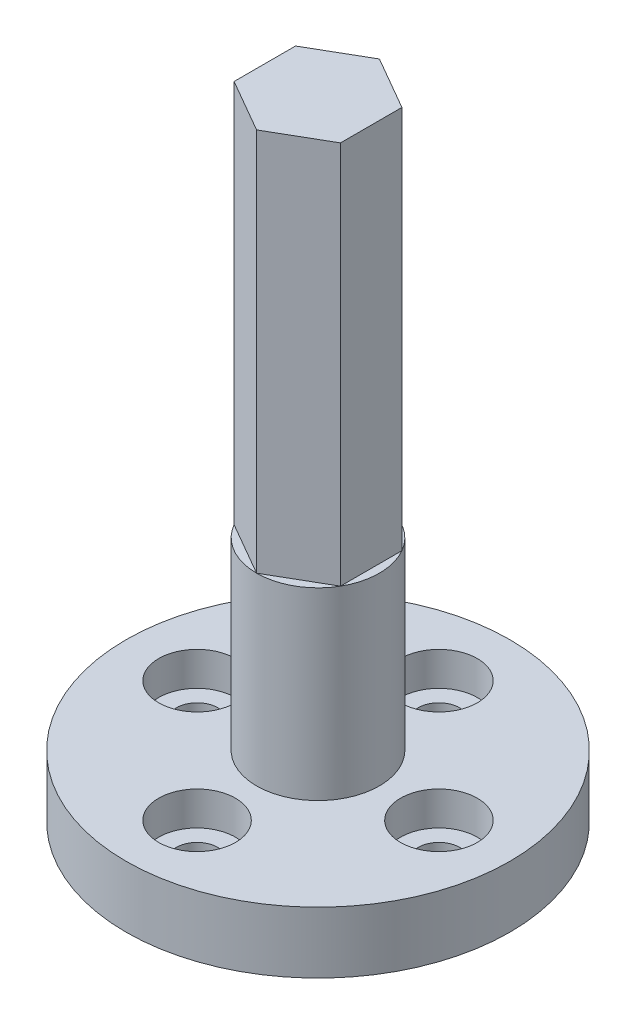
ISO-10303-21;
HEADER;
FILE_DESCRIPTION(('STEP AP214'),'2;1');
FILE_NAME('part.step','',(''),(''),'','','');
FILE_SCHEMA(('AUTOMOTIVE_DESIGN { 1 0 10303 214 1 1 1 1 }'));
ENDSEC;
DATA;
#1=APPLICATION_CONTEXT('core data for automotive mechanical design processes');
#2=APPLICATION_PROTOCOL_DEFINITION('international standard','automotive_design',2000,#1);
#3=PRODUCT_CONTEXT('',#1,'mechanical');
#4=PRODUCT('Part','Part','',(#3));
#5=PRODUCT_RELATED_PRODUCT_CATEGORY('part','',(#4));
#6=PRODUCT_DEFINITION_FORMATION('','',#4);
#7=PRODUCT_DEFINITION_CONTEXT('part definition',#1,'design');
#8=PRODUCT_DEFINITION('design','',#6,#7);
#9=PRODUCT_DEFINITION_SHAPE('','',#8);
#10=(LENGTH_UNIT() NAMED_UNIT(*) SI_UNIT(.MILLI.,.METRE.));
#11=(NAMED_UNIT(*) PLANE_ANGLE_UNIT() SI_UNIT($,.RADIAN.));
#12=(NAMED_UNIT(*) SI_UNIT($,.STERADIAN.) SOLID_ANGLE_UNIT());
#13=UNCERTAINTY_MEASURE_WITH_UNIT(LENGTH_MEASURE(1.E-05),#10,'distance_accuracy_value','');
#14=(GEOMETRIC_REPRESENTATION_CONTEXT(3) GLOBAL_UNCERTAINTY_ASSIGNED_CONTEXT((#13)) GLOBAL_UNIT_ASSIGNED_CONTEXT((#10,
#11,#12)) REPRESENTATION_CONTEXT('',''));
#15=CARTESIAN_POINT('',(0.,0.,0.));
#16=DIRECTION('',(0.,0.,1.));
#17=DIRECTION('',(1.,0.,0.));
#18=AXIS2_PLACEMENT_3D('',#15,#16,#17);
#19=CARTESIAN_POINT('',(-7.875,10.,0.));
#20=DIRECTION('',(0.,-1.,0.));
#21=DIRECTION('',(0.,0.,-1.));
#22=AXIS2_PLACEMENT_3D('',#19,#20,#21);
#23=CYLINDRICAL_SURFACE('',#22,1.35);
#24=CARTESIAN_POINT('',(-7.875,0.,0.));
#25=DIRECTION('',(0.,-1.,0.));
#26=DIRECTION('',(0.,0.,-1.));
#27=AXIS2_PLACEMENT_3D('',#24,#25,#26);
#28=CIRCLE('',#27,1.35);
#29=CARTESIAN_POINT('',(-7.875,0.,-1.34999999999992));
#30=VERTEX_POINT('',#29);
#31=EDGE_CURVE('E174',#30,#30,#28,.T.);
#32=ORIENTED_EDGE('',*,*,#31,.T.);
#33=EDGE_LOOP('',(#32));
#34=FACE_BOUND('',#33,.T.);
#35=CARTESIAN_POINT('',(-7.875,1.8,0.));
#36=DIRECTION('',(0.,1.,0.));
#37=DIRECTION('',(0.,0.,1.));
#38=AXIS2_PLACEMENT_3D('',#35,#36,#37);
#39=CIRCLE('',#38,1.35);
#40=CARTESIAN_POINT('',(-7.875,1.8,1.35000000000008));
#41=VERTEX_POINT('',#40);
#42=EDGE_CURVE('E52',#41,#41,#39,.F.);
#43=ORIENTED_EDGE('',*,*,#42,.F.);
#44=EDGE_LOOP('',(#43));
#45=FACE_BOUND('',#44,.T.);
#46=ADVANCED_FACE('F48',(#34,#45),#23,.F.);
#47=CARTESIAN_POINT('',(0.,10.,-7.875));
#48=DIRECTION('',(0.,-1.,0.));
#49=DIRECTION('',(0.,0.,-1.));
#50=AXIS2_PLACEMENT_3D('',#47,#48,#49);
#51=CYLINDRICAL_SURFACE('',#50,1.35);
#52=CARTESIAN_POINT('',(0.,0.,-7.875));
#53=DIRECTION('',(0.,-1.,0.));
#54=DIRECTION('',(0.,0.,-1.));
#55=AXIS2_PLACEMENT_3D('',#52,#53,#54);
#56=CIRCLE('',#55,1.35);
#57=CARTESIAN_POINT('',(0.,0.,-9.225));
#58=VERTEX_POINT('',#57);
#59=EDGE_CURVE('E179',#58,#58,#56,.T.);
#60=ORIENTED_EDGE('',*,*,#59,.T.);
#61=EDGE_LOOP('',(#60));
#62=FACE_BOUND('',#61,.T.);
#63=CARTESIAN_POINT('',(0.,1.8,-7.875));
#64=DIRECTION('',(0.,1.,0.));
#65=DIRECTION('',(0.,0.,1.));
#66=AXIS2_PLACEMENT_3D('',#63,#64,#65);
#67=CIRCLE('',#66,1.35);
#68=CARTESIAN_POINT('',(0.,1.8,-6.525));
#69=VERTEX_POINT('',#68);
#70=EDGE_CURVE('E167',#69,#69,#67,.F.);
#71=ORIENTED_EDGE('',*,*,#70,.F.);
#72=EDGE_LOOP('',(#71));
#73=FACE_BOUND('',#72,.T.);
#74=ADVANCED_FACE('F260',(#62,#73),#51,.F.);
#75=CARTESIAN_POINT('',(7.875,10.,0.));
#76=DIRECTION('',(0.,-1.,0.));
#77=DIRECTION('',(0.,0.,-1.));
#78=AXIS2_PLACEMENT_3D('',#75,#76,#77);
#79=CYLINDRICAL_SURFACE('',#78,1.35);
#80=CARTESIAN_POINT('',(7.875,0.,0.));
#81=DIRECTION('',(0.,-1.,0.));
#82=DIRECTION('',(0.,0.,-1.));
#83=AXIS2_PLACEMENT_3D('',#80,#81,#82);
#84=CIRCLE('',#83,1.35);
#85=CARTESIAN_POINT('',(7.875,0.,-1.35000000000003));
#86=VERTEX_POINT('',#85);
#87=EDGE_CURVE('E185',#86,#86,#84,.T.);
#88=ORIENTED_EDGE('',*,*,#87,.T.);
#89=EDGE_LOOP('',(#88));
#90=FACE_BOUND('',#89,.T.);
#91=CARTESIAN_POINT('',(7.875,1.8,0.));
#92=DIRECTION('',(0.,1.,0.));
#93=DIRECTION('',(0.,0.,1.));
#94=AXIS2_PLACEMENT_3D('',#91,#92,#93);
#95=CIRCLE('',#94,1.35);
#96=CARTESIAN_POINT('',(7.875,1.8,1.34999999999997));
#97=VERTEX_POINT('',#96);
#98=EDGE_CURVE('E163',#97,#97,#95,.F.);
#99=ORIENTED_EDGE('',*,*,#98,.F.);
#100=EDGE_LOOP('',(#99));
#101=FACE_BOUND('',#100,.T.);
#102=ADVANCED_FACE('F265',(#90,#101),#79,.F.);
#103=CARTESIAN_POINT('',(0.,10.,7.875));
#104=DIRECTION('',(0.,-1.,0.));
#105=DIRECTION('',(0.,0.,-1.));
#106=AXIS2_PLACEMENT_3D('',#103,#104,#105);
#107=CYLINDRICAL_SURFACE('',#106,1.35);
#108=CARTESIAN_POINT('',(0.,0.,7.875));
#109=DIRECTION('',(0.,-1.,0.));
#110=DIRECTION('',(0.,0.,-1.));
#111=AXIS2_PLACEMENT_3D('',#108,#109,#110);
#112=CIRCLE('',#111,1.35);
#113=CARTESIAN_POINT('',(0.,0.,6.525));
#114=VERTEX_POINT('',#113);
#115=EDGE_CURVE('E204',#114,#114,#112,.T.);
#116=ORIENTED_EDGE('',*,*,#115,.T.);
#117=EDGE_LOOP('',(#116));
#118=FACE_BOUND('',#117,.T.);
#119=CARTESIAN_POINT('',(0.,1.8,7.875));
#120=DIRECTION('',(0.,1.,0.));
#121=DIRECTION('',(0.,0.,1.));
#122=AXIS2_PLACEMENT_3D('',#119,#120,#121);
#123=CIRCLE('',#122,1.35);
#124=CARTESIAN_POINT('',(0.,1.8,9.225));
#125=VERTEX_POINT('',#124);
#126=EDGE_CURVE('E159',#125,#125,#123,.F.);
#127=ORIENTED_EDGE('',*,*,#126,.F.);
#128=EDGE_LOOP('',(#127));
#129=FACE_BOUND('',#128,.T.);
#130=ADVANCED_FACE('F295',(#118,#129),#107,.F.);
#131=CARTESIAN_POINT('',(0.,41.,0.));
#132=DIRECTION('',(0.,-1.,0.));
#133=DIRECTION('',(0.,0.,-1.));
#134=AXIS2_PLACEMENT_3D('',#131,#132,#133);
#135=CYLINDRICAL_SURFACE('',#134,4.);
#136=CARTESIAN_POINT('',(0.,4.,0.));
#137=DIRECTION('',(0.,1.,0.));
#138=DIRECTION('',(0.,0.,1.));
#139=AXIS2_PLACEMENT_3D('',#136,#137,#138);
#140=CIRCLE('',#139,4.);
#141=CARTESIAN_POINT('',(0.,4.,4.));
#142=VERTEX_POINT('',#141);
#143=EDGE_CURVE('E148',#142,#142,#140,.T.);
#144=ORIENTED_EDGE('',*,*,#143,.T.);
#145=EDGE_LOOP('',(#144));
#146=FACE_BOUND('',#145,.T.);
#147=CARTESIAN_POINT('',(0.,16.,0.));
#148=DIRECTION('',(0.,1.,0.));
#149=DIRECTION('',(0.,0.,1.));
#150=AXIS2_PLACEMENT_3D('',#147,#148,#149);
#151=CIRCLE('',#150,4.);
#152=CARTESIAN_POINT('',(0.,16.,-4.));
#153=VERTEX_POINT('',#152);
#154=CARTESIAN_POINT('',(-3.46410161513775,16.,-2.));
#155=VERTEX_POINT('',#154);
#156=EDGE_CURVE('E12',#153,#155,#151,.T.);
#157=ORIENTED_EDGE('',*,*,#156,.F.);
#158=CARTESIAN_POINT('',(3.46410161513775,16.,-2.));
#159=VERTEX_POINT('',#158);
#160=EDGE_CURVE('E58',#159,#153,#151,.T.);
#161=ORIENTED_EDGE('',*,*,#160,.F.);
#162=CARTESIAN_POINT('',(3.46410161513775,16.,2.));
#163=VERTEX_POINT('',#162);
#164=EDGE_CURVE('E113',#163,#159,#151,.T.);
#165=ORIENTED_EDGE('',*,*,#164,.F.);
#166=CARTESIAN_POINT('',(0.,16.,4.));
#167=VERTEX_POINT('',#166);
#168=EDGE_CURVE('E151',#167,#163,#151,.T.);
#169=ORIENTED_EDGE('',*,*,#168,.F.);
#170=CARTESIAN_POINT('',(-3.46410161513775,16.,2.));
#171=VERTEX_POINT('',#170);
#172=EDGE_CURVE('E145',#171,#167,#151,.T.);
#173=ORIENTED_EDGE('',*,*,#172,.F.);
#174=EDGE_CURVE('E60',#155,#171,#151,.T.);
#175=ORIENTED_EDGE('',*,*,#174,.F.);
#176=EDGE_LOOP('',(#157,#161,#165,#169,#173,#175));
#177=FACE_BOUND('',#176,.T.);
#178=ADVANCED_FACE('F141',(#146,#177),#135,.T.);
#179=CARTESIAN_POINT('',(0.,4.,0.));
#180=DIRECTION('',(0.,-1.,0.));
#181=DIRECTION('',(0.,0.,-1.));
#182=AXIS2_PLACEMENT_3D('',#179,#180,#181);
#183=CYLINDRICAL_SURFACE('',#182,12.5);
#184=CARTESIAN_POINT('',(0.,4.,0.));
#185=DIRECTION('',(0.,1.,0.));
#186=DIRECTION('',(0.,0.,1.));
#187=AXIS2_PLACEMENT_3D('',#184,#185,#186);
#188=CIRCLE('',#187,12.5);
#189=CARTESIAN_POINT('',(0.,4.,12.5));
#190=VERTEX_POINT('',#189);
#191=EDGE_CURVE('E153',#190,#190,#188,.T.);
#192=ORIENTED_EDGE('',*,*,#191,.F.);
#193=EDGE_LOOP('',(#192));
#194=FACE_BOUND('',#193,.T.);
#195=CARTESIAN_POINT('',(0.,0.,0.));
#196=DIRECTION('',(0.,1.,0.));
#197=DIRECTION('',(0.,0.,1.));
#198=AXIS2_PLACEMENT_3D('',#195,#196,#197);
#199=CIRCLE('',#198,12.5);
#200=CARTESIAN_POINT('',(0.,0.,12.5));
#201=VERTEX_POINT('',#200);
#202=EDGE_CURVE('E157',#201,#201,#199,.T.);
#203=ORIENTED_EDGE('',*,*,#202,.T.);
#204=EDGE_LOOP('',(#203));
#205=FACE_BOUND('',#204,.T.);
#206=ADVANCED_FACE('F50',(#194,#205),#183,.T.);
#207=CARTESIAN_POINT('',(0.,4.,0.));
#208=DIRECTION('',(0.,1.,0.));
#209=DIRECTION('',(0.,0.,1.));
#210=AXIS2_PLACEMENT_3D('',#207,#208,#209);
#211=PLANE('',#210);
#212=CARTESIAN_POINT('',(0.,4.,-7.875));
#213=DIRECTION('',(0.,1.,0.));
#214=DIRECTION('',(0.,0.,1.));
#215=AXIS2_PLACEMENT_3D('',#212,#213,#214);
#216=CIRCLE('',#215,2.5);
#217=CARTESIAN_POINT('',(0.,4.,-5.375));
#218=VERTEX_POINT('',#217);
#219=EDGE_CURVE('E348',#218,#218,#216,.T.);
#220=ORIENTED_EDGE('',*,*,#219,.F.);
#221=EDGE_LOOP('',(#220));
#222=FACE_BOUND('',#221,.T.);
#223=CARTESIAN_POINT('',(7.875,4.,0.));
#224=DIRECTION('',(0.,1.,0.));
#225=DIRECTION('',(0.,0.,1.));
#226=AXIS2_PLACEMENT_3D('',#223,#224,#225);
#227=CIRCLE('',#226,2.5);
#228=CARTESIAN_POINT('',(7.875,4.,2.49999999999997));
#229=VERTEX_POINT('',#228);
#230=EDGE_CURVE('E352',#229,#229,#227,.T.);
#231=ORIENTED_EDGE('',*,*,#230,.F.);
#232=EDGE_LOOP('',(#231));
#233=FACE_BOUND('',#232,.T.);
#234=CARTESIAN_POINT('',(0.,4.,7.875));
#235=DIRECTION('',(0.,1.,0.));
#236=DIRECTION('',(0.,0.,1.));
#237=AXIS2_PLACEMENT_3D('',#234,#235,#236);
#238=CIRCLE('',#237,2.5);
#239=CARTESIAN_POINT('',(0.,4.,10.375));
#240=VERTEX_POINT('',#239);
#241=EDGE_CURVE('E362',#240,#240,#238,.T.);
#242=ORIENTED_EDGE('',*,*,#241,.F.);
#243=EDGE_LOOP('',(#242));
#244=FACE_BOUND('',#243,.T.);
#245=CARTESIAN_POINT('',(-7.875,4.,0.));
#246=DIRECTION('',(0.,1.,0.));
#247=DIRECTION('',(0.,0.,1.));
#248=AXIS2_PLACEMENT_3D('',#245,#246,#247);
#249=CIRCLE('',#248,2.5);
#250=CARTESIAN_POINT('',(-7.875,4.,2.49999999999997));
#251=VERTEX_POINT('',#250);
#252=EDGE_CURVE('E370',#251,#251,#249,.T.);
#253=ORIENTED_EDGE('',*,*,#252,.F.);
#254=EDGE_LOOP('',(#253));
#255=FACE_BOUND('',#254,.T.);
#256=ORIENTED_EDGE('',*,*,#143,.F.);
#257=EDGE_LOOP('',(#256));
#258=FACE_BOUND('',#257,.T.);
#259=ORIENTED_EDGE('',*,*,#191,.T.);
#260=EDGE_LOOP('',(#259));
#261=FACE_BOUND('',#260,.T.);
#262=ADVANCED_FACE('F244',(#222,#233,#244,#255,#258,#261),#211,.T.);
#263=CARTESIAN_POINT('',(0.,0.,0.));
#264=DIRECTION('',(0.,1.,0.));
#265=DIRECTION('',(0.,0.,1.));
#266=AXIS2_PLACEMENT_3D('',#263,#264,#265);
#267=PLANE('',#266);
#268=ORIENTED_EDGE('',*,*,#115,.F.);
#269=EDGE_LOOP('',(#268));
#270=FACE_BOUND('',#269,.T.);
#271=ORIENTED_EDGE('',*,*,#87,.F.);
#272=EDGE_LOOP('',(#271));
#273=FACE_BOUND('',#272,.T.);
#274=ORIENTED_EDGE('',*,*,#59,.F.);
#275=EDGE_LOOP('',(#274));
#276=FACE_BOUND('',#275,.T.);
#277=ORIENTED_EDGE('',*,*,#31,.F.);
#278=EDGE_LOOP('',(#277));
#279=FACE_BOUND('',#278,.T.);
#280=ORIENTED_EDGE('',*,*,#202,.F.);
#281=EDGE_LOOP('',(#280));
#282=FACE_BOUND('',#281,.T.);
#283=ADVANCED_FACE('F241',(#270,#273,#276,#279,#282),#267,.F.);
#284=CARTESIAN_POINT('',(0.,16.,0.));
#285=DIRECTION('',(0.,1.,0.));
#286=DIRECTION('',(0.,0.,1.));
#287=AXIS2_PLACEMENT_3D('',#284,#285,#286);
#288=PLANE('',#287);
#289=ORIENTED_EDGE('',*,*,#168,.T.);
#290=DIRECTION('',(0.866025403784439,0.,-0.5));
#291=VECTOR('',#290,1.);
#292=CARTESIAN_POINT('',(0.,16.,4.));
#293=LINE('',#292,#291);
#294=EDGE_CURVE('E195',#167,#163,#293,.T.);
#295=ORIENTED_EDGE('',*,*,#294,.F.);
#296=EDGE_LOOP('',(#289,#295));
#297=FACE_BOUND('',#296,.T.);
#298=ADVANCED_FACE('F243',(#297),#288,.T.);
#299=ORIENTED_EDGE('',*,*,#164,.T.);
#300=DIRECTION('',(0.,0.,-1.));
#301=VECTOR('',#300,1.);
#302=CARTESIAN_POINT('',(3.46410161513775,16.,2.));
#303=LINE('',#302,#301);
#304=EDGE_CURVE('E129',#163,#159,#303,.T.);
#305=ORIENTED_EDGE('',*,*,#304,.F.);
#306=EDGE_LOOP('',(#299,#305));
#307=FACE_BOUND('',#306,.T.);
#308=ADVANCED_FACE('F251',(#307),#288,.T.);
#309=ORIENTED_EDGE('',*,*,#160,.T.);
#310=DIRECTION('',(-0.866025403784439,0.,-0.5));
#311=VECTOR('',#310,1.);
#312=CARTESIAN_POINT('',(3.46410161513775,16.,-2.));
#313=LINE('',#312,#311);
#314=EDGE_CURVE('E107',#159,#153,#313,.T.);
#315=ORIENTED_EDGE('',*,*,#314,.F.);
#316=EDGE_LOOP('',(#309,#315));
#317=FACE_BOUND('',#316,.T.);
#318=ADVANCED_FACE('F105',(#317),#288,.T.);
#319=ORIENTED_EDGE('',*,*,#156,.T.);
#320=DIRECTION('',(-0.866025403784439,0.,0.5));
#321=VECTOR('',#320,1.);
#322=CARTESIAN_POINT('',(0.,16.,-4.));
#323=LINE('',#322,#321);
#324=EDGE_CURVE('E120',#153,#155,#323,.T.);
#325=ORIENTED_EDGE('',*,*,#324,.F.);
#326=EDGE_LOOP('',(#319,#325));
#327=FACE_BOUND('',#326,.T.);
#328=ADVANCED_FACE('F132',(#327),#288,.T.);
#329=ORIENTED_EDGE('',*,*,#174,.T.);
#330=DIRECTION('',(0.,0.,1.));
#331=VECTOR('',#330,1.);
#332=CARTESIAN_POINT('',(-3.46410161513775,16.,-2.));
#333=LINE('',#332,#331);
#334=EDGE_CURVE('E67',#155,#171,#333,.T.);
#335=ORIENTED_EDGE('',*,*,#334,.F.);
#336=EDGE_LOOP('',(#329,#335));
#337=FACE_BOUND('',#336,.T.);
#338=ADVANCED_FACE('F503',(#337),#288,.T.);
#339=ORIENTED_EDGE('',*,*,#172,.T.);
#340=DIRECTION('',(0.866025403784439,0.,0.5));
#341=VECTOR('',#340,1.);
#342=CARTESIAN_POINT('',(-3.46410161513775,16.,2.));
#343=LINE('',#342,#341);
#344=EDGE_CURVE('E191',#171,#167,#343,.T.);
#345=ORIENTED_EDGE('',*,*,#344,.F.);
#346=EDGE_LOOP('',(#339,#345));
#347=FACE_BOUND('',#346,.T.);
#348=ADVANCED_FACE('F254',(#347),#288,.T.);
#349=CARTESIAN_POINT('',(3.46410161513775,16.,-2.));
#350=DIRECTION('',(0.5,0.,-0.866025403784439));
#351=DIRECTION('',(-0.866025403784439,0.,-0.5));
#352=AXIS2_PLACEMENT_3D('',#349,#350,#351);
#353=PLANE('',#352);
#354=DIRECTION('',(-0.866025403784439,0.,-0.5));
#355=VECTOR('',#354,1.);
#356=CARTESIAN_POINT('',(3.46410161513775,41.,-2.));
#357=LINE('',#356,#355);
#358=CARTESIAN_POINT('',(3.46410161513775,41.,-2.));
#359=VERTEX_POINT('',#358);
#360=CARTESIAN_POINT('',(0.,41.,-4.));
#361=VERTEX_POINT('',#360);
#362=EDGE_CURVE('E201',#359,#361,#357,.T.);
#363=ORIENTED_EDGE('',*,*,#362,.F.);
#364=DIRECTION('',(0.,1.,0.));
#365=VECTOR('',#364,1.);
#366=CARTESIAN_POINT('',(3.46410161513775,16.,-2.));
#367=LINE('',#366,#365);
#368=EDGE_CURVE('E137',#159,#359,#367,.T.);
#369=ORIENTED_EDGE('',*,*,#368,.F.);
#370=ORIENTED_EDGE('',*,*,#314,.T.);
#371=DIRECTION('',(0.,1.,0.));
#372=VECTOR('',#371,1.);
#373=CARTESIAN_POINT('',(0.,16.,-4.));
#374=LINE('',#373,#372);
#375=EDGE_CURVE('E117',#153,#361,#374,.T.);
#376=ORIENTED_EDGE('',*,*,#375,.T.);
#377=EDGE_LOOP('',(#363,#369,#370,#376));
#378=FACE_BOUND('',#377,.T.);
#379=ADVANCED_FACE('F136',(#378),#353,.T.);
#380=CARTESIAN_POINT('',(3.46410161513775,16.,2.));
#381=DIRECTION('',(1.,0.,0.));
#382=DIRECTION('',(0.,0.,-1.));
#383=AXIS2_PLACEMENT_3D('',#380,#381,#382);
#384=PLANE('',#383);
#385=DIRECTION('',(0.,0.,-1.));
#386=VECTOR('',#385,1.);
#387=CARTESIAN_POINT('',(3.46410161513775,41.,2.));
#388=LINE('',#387,#386);
#389=CARTESIAN_POINT('',(3.46410161513775,41.,2.));
#390=VERTEX_POINT('',#389);
#391=EDGE_CURVE('E139',#390,#359,#388,.T.);
#392=ORIENTED_EDGE('',*,*,#391,.F.);
#393=DIRECTION('',(0.,1.,0.));
#394=VECTOR('',#393,1.);
#395=CARTESIAN_POINT('',(3.46410161513775,16.,2.));
#396=LINE('',#395,#394);
#397=EDGE_CURVE('E222',#163,#390,#396,.T.);
#398=ORIENTED_EDGE('',*,*,#397,.F.);
#399=ORIENTED_EDGE('',*,*,#304,.T.);
#400=ORIENTED_EDGE('',*,*,#368,.T.);
#401=EDGE_LOOP('',(#392,#398,#399,#400));
#402=FACE_BOUND('',#401,.T.);
#403=ADVANCED_FACE('F271',(#402),#384,.T.);
#404=CARTESIAN_POINT('',(0.,16.,4.));
#405=DIRECTION('',(0.5,0.,0.866025403784439));
#406=DIRECTION('',(0.866025403784439,0.,-0.5));
#407=AXIS2_PLACEMENT_3D('',#404,#405,#406);
#408=PLANE('',#407);
#409=DIRECTION('',(0.866025403784439,0.,-0.5));
#410=VECTOR('',#409,1.);
#411=CARTESIAN_POINT('',(0.,41.,4.));
#412=LINE('',#411,#410);
#413=CARTESIAN_POINT('',(0.,41.,4.));
#414=VERTEX_POINT('',#413);
#415=EDGE_CURVE('E213',#414,#390,#412,.T.);
#416=ORIENTED_EDGE('',*,*,#415,.F.);
#417=DIRECTION('',(0.,1.,0.));
#418=VECTOR('',#417,1.);
#419=CARTESIAN_POINT('',(0.,16.,4.));
#420=LINE('',#419,#418);
#421=EDGE_CURVE('E225',#167,#414,#420,.T.);
#422=ORIENTED_EDGE('',*,*,#421,.F.);
#423=ORIENTED_EDGE('',*,*,#294,.T.);
#424=ORIENTED_EDGE('',*,*,#397,.T.);
#425=EDGE_LOOP('',(#416,#422,#423,#424));
#426=FACE_BOUND('',#425,.T.);
#427=ADVANCED_FACE('F274',(#426),#408,.T.);
#428=CARTESIAN_POINT('',(-3.46410161513775,16.,2.));
#429=DIRECTION('',(-0.5,0.,0.866025403784439));
#430=DIRECTION('',(0.866025403784439,0.,0.5));
#431=AXIS2_PLACEMENT_3D('',#428,#429,#430);
#432=PLANE('',#431);
#433=DIRECTION('',(0.866025403784439,0.,0.5));
#434=VECTOR('',#433,1.);
#435=CARTESIAN_POINT('',(-3.46410161513775,41.,2.));
#436=LINE('',#435,#434);
#437=CARTESIAN_POINT('',(-3.46410161513775,41.,2.));
#438=VERTEX_POINT('',#437);
#439=EDGE_CURVE('E209',#438,#414,#436,.T.);
#440=ORIENTED_EDGE('',*,*,#439,.F.);
#441=DIRECTION('',(0.,1.,0.));
#442=VECTOR('',#441,1.);
#443=CARTESIAN_POINT('',(-3.46410161513775,16.,2.));
#444=LINE('',#443,#442);
#445=EDGE_CURVE('E228',#171,#438,#444,.T.);
#446=ORIENTED_EDGE('',*,*,#445,.F.);
#447=ORIENTED_EDGE('',*,*,#344,.T.);
#448=ORIENTED_EDGE('',*,*,#421,.T.);
#449=EDGE_LOOP('',(#440,#446,#447,#448));
#450=FACE_BOUND('',#449,.T.);
#451=ADVANCED_FACE('F278',(#450),#432,.T.);
#452=CARTESIAN_POINT('',(-3.46410161513775,16.,-2.));
#453=DIRECTION('',(-1.,0.,0.));
#454=DIRECTION('',(0.,0.,1.));
#455=AXIS2_PLACEMENT_3D('',#452,#453,#454);
#456=PLANE('',#455);
#457=DIRECTION('',(0.,0.,1.));
#458=VECTOR('',#457,1.);
#459=CARTESIAN_POINT('',(-3.46410161513775,41.,-2.));
#460=LINE('',#459,#458);
#461=CARTESIAN_POINT('',(-3.46410161513775,41.,-2.));
#462=VERTEX_POINT('',#461);
#463=EDGE_CURVE('E72',#462,#438,#460,.T.);
#464=ORIENTED_EDGE('',*,*,#463,.F.);
#465=DIRECTION('',(0.,1.,0.));
#466=VECTOR('',#465,1.);
#467=CARTESIAN_POINT('',(-3.46410161513775,16.,-2.));
#468=LINE('',#467,#466);
#469=EDGE_CURVE('E128',#155,#462,#468,.T.);
#470=ORIENTED_EDGE('',*,*,#469,.F.);
#471=ORIENTED_EDGE('',*,*,#334,.T.);
#472=ORIENTED_EDGE('',*,*,#445,.T.);
#473=EDGE_LOOP('',(#464,#470,#471,#472));
#474=FACE_BOUND('',#473,.T.);
#475=ADVANCED_FACE('F282',(#474),#456,.T.);
#476=CARTESIAN_POINT('',(0.,16.,-4.));
#477=DIRECTION('',(-0.5,0.,-0.866025403784439));
#478=DIRECTION('',(-0.866025403784439,0.,0.5));
#479=AXIS2_PLACEMENT_3D('',#476,#477,#478);
#480=PLANE('',#479);
#481=DIRECTION('',(-0.866025403784439,0.,0.5));
#482=VECTOR('',#481,1.);
#483=CARTESIAN_POINT('',(0.,41.,-4.));
#484=LINE('',#483,#482);
#485=EDGE_CURVE('E123',#361,#462,#484,.T.);
#486=ORIENTED_EDGE('',*,*,#485,.F.);
#487=ORIENTED_EDGE('',*,*,#375,.F.);
#488=ORIENTED_EDGE('',*,*,#324,.T.);
#489=ORIENTED_EDGE('',*,*,#469,.T.);
#490=EDGE_LOOP('',(#486,#487,#488,#489));
#491=FACE_BOUND('',#490,.T.);
#492=ADVANCED_FACE('F119',(#491),#480,.T.);
#493=CARTESIAN_POINT('',(0.,41.,0.));
#494=DIRECTION('',(0.,1.,0.));
#495=DIRECTION('',(0.,0.,1.));
#496=AXIS2_PLACEMENT_3D('',#493,#494,#495);
#497=PLANE('',#496);
#498=ORIENTED_EDGE('',*,*,#391,.T.);
#499=ORIENTED_EDGE('',*,*,#362,.T.);
#500=ORIENTED_EDGE('',*,*,#485,.T.);
#501=ORIENTED_EDGE('',*,*,#463,.T.);
#502=ORIENTED_EDGE('',*,*,#439,.T.);
#503=ORIENTED_EDGE('',*,*,#415,.T.);
#504=EDGE_LOOP('',(#498,#499,#500,#501,#502,#503));
#505=FACE_BOUND('',#504,.T.);
#506=ADVANCED_FACE('F288',(#505),#497,.T.);
#507=CARTESIAN_POINT('',(0.,1.8,7.875));
#508=DIRECTION('',(0.,1.,0.));
#509=DIRECTION('',(0.,0.,1.));
#510=AXIS2_PLACEMENT_3D('',#507,#508,#509);
#511=PLANE('',#510);
#512=CARTESIAN_POINT('',(0.,1.8,7.875));
#513=DIRECTION('',(0.,1.,0.));
#514=DIRECTION('',(0.,0.,1.));
#515=AXIS2_PLACEMENT_3D('',#512,#513,#514);
#516=CIRCLE('',#515,2.5);
#517=CARTESIAN_POINT('',(0.,1.8,10.375));
#518=VERTEX_POINT('',#517);
#519=EDGE_CURVE('E366',#518,#518,#516,.T.);
#520=ORIENTED_EDGE('',*,*,#519,.T.);
#521=EDGE_LOOP('',(#520));
#522=FACE_BOUND('',#521,.T.);
#523=ORIENTED_EDGE('',*,*,#126,.T.);
#524=EDGE_LOOP('',(#523));
#525=FACE_BOUND('',#524,.T.);
#526=ADVANCED_FACE('F292',(#522,#525),#511,.T.);
#527=CARTESIAN_POINT('',(0.,1.8,7.875));
#528=DIRECTION('',(0.,1.,0.));
#529=DIRECTION('',(0.,0.,1.));
#530=AXIS2_PLACEMENT_3D('',#527,#528,#529);
#531=CYLINDRICAL_SURFACE('',#530,2.5);
#532=ORIENTED_EDGE('',*,*,#519,.F.);
#533=EDGE_LOOP('',(#532));
#534=FACE_BOUND('',#533,.T.);
#535=ORIENTED_EDGE('',*,*,#241,.T.);
#536=EDGE_LOOP('',(#535));
#537=FACE_BOUND('',#536,.T.);
#538=ADVANCED_FACE('F324',(#534,#537),#531,.F.);
#539=CARTESIAN_POINT('',(7.875,1.8,0.));
#540=DIRECTION('',(0.,1.,0.));
#541=DIRECTION('',(0.,0.,1.));
#542=AXIS2_PLACEMENT_3D('',#539,#540,#541);
#543=PLANE('',#542);
#544=CARTESIAN_POINT('',(7.875,1.8,0.));
#545=DIRECTION('',(0.,1.,0.));
#546=DIRECTION('',(0.,0.,1.));
#547=AXIS2_PLACEMENT_3D('',#544,#545,#546);
#548=CIRCLE('',#547,2.5);
#549=CARTESIAN_POINT('',(7.875,1.8,2.49999999999997));
#550=VERTEX_POINT('',#549);
#551=EDGE_CURVE('E358',#550,#550,#548,.T.);
#552=ORIENTED_EDGE('',*,*,#551,.T.);
#553=EDGE_LOOP('',(#552));
#554=FACE_BOUND('',#553,.T.);
#555=ORIENTED_EDGE('',*,*,#98,.T.);
#556=EDGE_LOOP('',(#555));
#557=FACE_BOUND('',#556,.T.);
#558=ADVANCED_FACE('F328',(#554,#557),#543,.T.);
#559=CARTESIAN_POINT('',(7.875,1.8,0.));
#560=DIRECTION('',(0.,1.,0.));
#561=DIRECTION('',(0.,0.,1.));
#562=AXIS2_PLACEMENT_3D('',#559,#560,#561);
#563=CYLINDRICAL_SURFACE('',#562,2.5);
#564=ORIENTED_EDGE('',*,*,#551,.F.);
#565=EDGE_LOOP('',(#564));
#566=FACE_BOUND('',#565,.T.);
#567=ORIENTED_EDGE('',*,*,#230,.T.);
#568=EDGE_LOOP('',(#567));
#569=FACE_BOUND('',#568,.T.);
#570=ADVANCED_FACE('F332',(#566,#569),#563,.F.);
#571=CARTESIAN_POINT('',(0.,1.8,-7.875));
#572=DIRECTION('',(0.,1.,0.));
#573=DIRECTION('',(0.,0.,1.));
#574=AXIS2_PLACEMENT_3D('',#571,#572,#573);
#575=PLANE('',#574);
#576=CARTESIAN_POINT('',(0.,1.8,-7.875));
#577=DIRECTION('',(0.,1.,0.));
#578=DIRECTION('',(0.,0.,1.));
#579=AXIS2_PLACEMENT_3D('',#576,#577,#578);
#580=CIRCLE('',#579,2.5);
#581=CARTESIAN_POINT('',(0.,1.8,-5.375));
#582=VERTEX_POINT('',#581);
#583=EDGE_CURVE('E164',#582,#582,#580,.T.);
#584=ORIENTED_EDGE('',*,*,#583,.T.);
#585=EDGE_LOOP('',(#584));
#586=FACE_BOUND('',#585,.T.);
#587=ORIENTED_EDGE('',*,*,#70,.T.);
#588=EDGE_LOOP('',(#587));
#589=FACE_BOUND('',#588,.T.);
#590=ADVANCED_FACE('F336',(#586,#589),#575,.T.);
#591=CARTESIAN_POINT('',(0.,1.8,-7.875));
#592=DIRECTION('',(0.,1.,0.));
#593=DIRECTION('',(0.,0.,1.));
#594=AXIS2_PLACEMENT_3D('',#591,#592,#593);
#595=CYLINDRICAL_SURFACE('',#594,2.5);
#596=ORIENTED_EDGE('',*,*,#583,.F.);
#597=EDGE_LOOP('',(#596));
#598=FACE_BOUND('',#597,.T.);
#599=ORIENTED_EDGE('',*,*,#219,.T.);
#600=EDGE_LOOP('',(#599));
#601=FACE_BOUND('',#600,.T.);
#602=ADVANCED_FACE('F317',(#598,#601),#595,.F.);
#603=CARTESIAN_POINT('',(-7.875,1.8,0.));
#604=DIRECTION('',(0.,1.,0.));
#605=DIRECTION('',(0.,0.,1.));
#606=AXIS2_PLACEMENT_3D('',#603,#604,#605);
#607=PLANE('',#606);
#608=CARTESIAN_POINT('',(-7.875,1.8,0.));
#609=DIRECTION('',(0.,1.,0.));
#610=DIRECTION('',(0.,0.,1.));
#611=AXIS2_PLACEMENT_3D('',#608,#609,#610);
#612=CIRCLE('',#611,2.5);
#613=CARTESIAN_POINT('',(-7.875,1.8,2.49999999999997));
#614=VERTEX_POINT('',#613);
#615=EDGE_CURVE('E374',#614,#614,#612,.T.);
#616=ORIENTED_EDGE('',*,*,#615,.T.);
#617=EDGE_LOOP('',(#616));
#618=FACE_BOUND('',#617,.T.);
#619=ORIENTED_EDGE('',*,*,#42,.T.);
#620=EDGE_LOOP('',(#619));
#621=FACE_BOUND('',#620,.T.);
#622=ADVANCED_FACE('F313',(#618,#621),#607,.T.);
#623=CARTESIAN_POINT('',(-7.875,1.8,0.));
#624=DIRECTION('',(0.,1.,0.));
#625=DIRECTION('',(0.,0.,1.));
#626=AXIS2_PLACEMENT_3D('',#623,#624,#625);
#627=CYLINDRICAL_SURFACE('',#626,2.5);
#628=ORIENTED_EDGE('',*,*,#615,.F.);
#629=EDGE_LOOP('',(#628));
#630=FACE_BOUND('',#629,.T.);
#631=ORIENTED_EDGE('',*,*,#252,.T.);
#632=EDGE_LOOP('',(#631));
#633=FACE_BOUND('',#632,.T.);
#634=ADVANCED_FACE('F316',(#630,#633),#627,.F.);
#635=CLOSED_SHELL('',(#46,#74,#102,#130,#178,#206,#262,#283,#298,#308,#318,#328,#338,#348,#379,
#403,#427,#451,#475,#492,#506,#526,#538,#558,#570,#590,#602,#622,#634));
#636=MANIFOLD_SOLID_BREP('B2',#635);
#637=ADVANCED_BREP_SHAPE_REPRESENTATION('',(#18,#636),#14);
#638=SHAPE_DEFINITION_REPRESENTATION(#9,#637);
ENDSEC;
END-ISO-10303-21;
